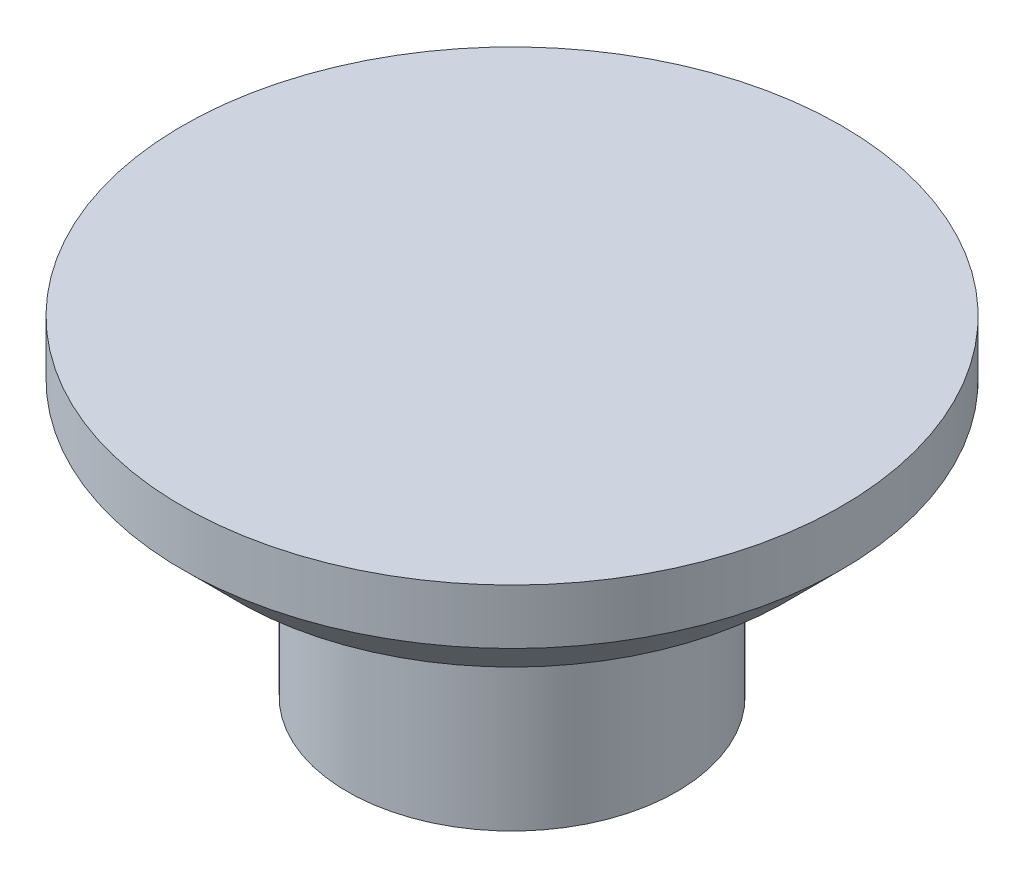
ISO-10303-21;
HEADER;
FILE_DESCRIPTION(('STEP AP214'),'2;1');
FILE_NAME('part.step','',(''),(''),'','','');
FILE_SCHEMA(('AUTOMOTIVE_DESIGN { 1 0 10303 214 1 1 1 1 }'));
ENDSEC;
DATA;
#1=APPLICATION_CONTEXT('core data for automotive mechanical design processes');
#2=APPLICATION_PROTOCOL_DEFINITION('international standard','automotive_design',2000,#1);
#3=PRODUCT_CONTEXT('',#1,'mechanical');
#4=PRODUCT('Part','Part','',(#3));
#5=PRODUCT_RELATED_PRODUCT_CATEGORY('part','',(#4));
#6=PRODUCT_DEFINITION_FORMATION('','',#4);
#7=PRODUCT_DEFINITION_CONTEXT('part definition',#1,'design');
#8=PRODUCT_DEFINITION('design','',#6,#7);
#9=PRODUCT_DEFINITION_SHAPE('','',#8);
#10=(LENGTH_UNIT() NAMED_UNIT(*) SI_UNIT(.MILLI.,.METRE.));
#11=(NAMED_UNIT(*) PLANE_ANGLE_UNIT() SI_UNIT($,.RADIAN.));
#12=(NAMED_UNIT(*) SI_UNIT($,.STERADIAN.) SOLID_ANGLE_UNIT());
#13=UNCERTAINTY_MEASURE_WITH_UNIT(LENGTH_MEASURE(1.E-05),#10,'distance_accuracy_value','');
#14=(GEOMETRIC_REPRESENTATION_CONTEXT(3) GLOBAL_UNCERTAINTY_ASSIGNED_CONTEXT((#13)) GLOBAL_UNIT_ASSIGNED_CONTEXT((#10,
#11,#12)) REPRESENTATION_CONTEXT('',''));
#15=CARTESIAN_POINT('',(0.,0.,0.));
#16=DIRECTION('',(0.,0.,1.));
#17=DIRECTION('',(1.,0.,0.));
#18=AXIS2_PLACEMENT_3D('',#15,#16,#17);
#19=CARTESIAN_POINT('',(0.,-6.,0.));
#20=DIRECTION('',(0.,-1.,0.));
#21=DIRECTION('',(1.,0.,0.));
#22=AXIS2_PLACEMENT_3D('',#19,#20,#21);
#23=SPHERICAL_SURFACE('',#22,1.5);
#24=CARTESIAN_POINT('',(0.,-6.,0.));
#25=DIRECTION('',(0.,-1.,0.));
#26=DIRECTION('',(0.,0.,-1.));
#27=AXIS2_PLACEMENT_3D('',#24,#25,#26);
#28=CIRCLE('',#27,1.5);
#29=CARTESIAN_POINT('',(0.,-6.,-1.5));
#30=VERTEX_POINT('',#29);
#31=EDGE_CURVE('E10',#30,#30,#28,.T.);
#32=ORIENTED_EDGE('',*,*,#31,.T.);
#33=EDGE_LOOP('',(#32));
#34=FACE_BOUND('',#33,.T.);
#35=ADVANCED_FACE('F28',(#34),#23,.F.);
#36=CARTESIAN_POINT('',(3.,-6.,0.));
#37=DIRECTION('',(0.,-1.,0.));
#38=DIRECTION('',(0.,0.,-1.));
#39=AXIS2_PLACEMENT_3D('',#36,#37,#38);
#40=PLANE('',#39);
#41=CARTESIAN_POINT('',(0.,-6.,0.));
#42=DIRECTION('',(0.,-1.,0.));
#43=DIRECTION('',(0.,0.,-1.));
#44=AXIS2_PLACEMENT_3D('',#41,#42,#43);
#45=CIRCLE('',#44,3.);
#46=CARTESIAN_POINT('',(0.,-6.,-3.));
#47=VERTEX_POINT('',#46);
#48=EDGE_CURVE('E34',#47,#47,#45,.T.);
#49=ORIENTED_EDGE('',*,*,#48,.T.);
#50=EDGE_LOOP('',(#49));
#51=FACE_BOUND('',#50,.T.);
#52=ORIENTED_EDGE('',*,*,#31,.F.);
#53=EDGE_LOOP('',(#52));
#54=FACE_BOUND('',#53,.T.);
#55=ADVANCED_FACE('F69',(#51,#54),#40,.T.);
#56=CARTESIAN_POINT('',(0.,-4.5,0.));
#57=DIRECTION('',(0.,-1.,0.));
#58=DIRECTION('',(0.,0.,-1.));
#59=AXIS2_PLACEMENT_3D('',#56,#57,#58);
#60=CYLINDRICAL_SURFACE('',#59,3.);
#61=CARTESIAN_POINT('',(0.,-3.00000000000001,0.));
#62=DIRECTION('',(0.,-1.,0.));
#63=DIRECTION('',(0.,0.,-1.));
#64=AXIS2_PLACEMENT_3D('',#61,#62,#63);
#65=CIRCLE('',#64,3.);
#66=CARTESIAN_POINT('',(0.,-3.00000000000001,-3.));
#67=VERTEX_POINT('',#66);
#68=EDGE_CURVE('E38',#67,#67,#65,.T.);
#69=ORIENTED_EDGE('',*,*,#68,.T.);
#70=EDGE_LOOP('',(#69));
#71=FACE_BOUND('',#70,.T.);
#72=ORIENTED_EDGE('',*,*,#48,.F.);
#73=EDGE_LOOP('',(#72));
#74=FACE_BOUND('',#73,.T.);
#75=ADVANCED_FACE('F73',(#71,#74),#60,.T.);
#76=CARTESIAN_POINT('',(0.,-3.,0.));
#77=DIRECTION('',(0.,-1.,0.));
#78=DIRECTION('',(0.,0.,-1.));
#79=AXIS2_PLACEMENT_3D('',#76,#77,#78);
#80=TOROIDAL_SURFACE('',#79,4.,1.);
#81=CARTESIAN_POINT('',(0.,-2.,0.));
#82=DIRECTION('',(0.,-1.,0.));
#83=DIRECTION('',(0.,0.,-1.));
#84=AXIS2_PLACEMENT_3D('',#81,#82,#83);
#85=CIRCLE('',#84,4.00000000000001);
#86=CARTESIAN_POINT('',(0.,-2.,-4.00000000000001));
#87=VERTEX_POINT('',#86);
#88=EDGE_CURVE('E42',#87,#87,#85,.T.);
#89=ORIENTED_EDGE('',*,*,#88,.T.);
#90=EDGE_LOOP('',(#89));
#91=FACE_BOUND('',#90,.T.);
#92=ORIENTED_EDGE('',*,*,#68,.F.);
#93=EDGE_LOOP('',(#92));
#94=FACE_BOUND('',#93,.T.);
#95=ADVANCED_FACE('F77',(#91,#94),#80,.F.);
#96=CARTESIAN_POINT('',(5.,-2.,0.));
#97=DIRECTION('',(0.,-1.,0.));
#98=DIRECTION('',(0.,0.,-1.));
#99=AXIS2_PLACEMENT_3D('',#96,#97,#98);
#100=PLANE('',#99);
#101=CARTESIAN_POINT('',(0.,-2.,0.));
#102=DIRECTION('',(0.,-1.,0.));
#103=DIRECTION('',(0.,0.,-1.));
#104=AXIS2_PLACEMENT_3D('',#101,#102,#103);
#105=CIRCLE('',#104,5.);
#106=CARTESIAN_POINT('',(0.,-2.,-5.));
#107=VERTEX_POINT('',#106);
#108=EDGE_CURVE('E47',#107,#107,#105,.T.);
#109=ORIENTED_EDGE('',*,*,#108,.T.);
#110=EDGE_LOOP('',(#109));
#111=FACE_BOUND('',#110,.T.);
#112=ORIENTED_EDGE('',*,*,#88,.F.);
#113=EDGE_LOOP('',(#112));
#114=FACE_BOUND('',#113,.T.);
#115=ADVANCED_FACE('F84',(#111,#114),#100,.T.);
#116=CARTESIAN_POINT('',(0.,-2.,0.));
#117=DIRECTION('',(0.,1.,0.));
#118=DIRECTION('',(0.,0.,1.));
#119=AXIS2_PLACEMENT_3D('',#116,#117,#118);
#120=CONICAL_SURFACE('',#119,5.,0.785398163397448);
#121=CARTESIAN_POINT('',(0.,-1.,0.));
#122=DIRECTION('',(0.,-1.,0.));
#123=DIRECTION('',(0.,0.,-1.));
#124=AXIS2_PLACEMENT_3D('',#121,#122,#123);
#125=CIRCLE('',#124,6.);
#126=CARTESIAN_POINT('',(0.,-1.,-6.));
#127=VERTEX_POINT('',#126);
#128=EDGE_CURVE('E50',#127,#127,#125,.T.);
#129=ORIENTED_EDGE('',*,*,#128,.T.);
#130=EDGE_LOOP('',(#129));
#131=FACE_BOUND('',#130,.T.);
#132=ORIENTED_EDGE('',*,*,#108,.F.);
#133=EDGE_LOOP('',(#132));
#134=FACE_BOUND('',#133,.T.);
#135=ADVANCED_FACE('F66',(#131,#134),#120,.T.);
#136=CARTESIAN_POINT('',(0.,-4.5,0.));
#137=DIRECTION('',(0.,-1.,0.));
#138=DIRECTION('',(0.,0.,-1.));
#139=AXIS2_PLACEMENT_3D('',#136,#137,#138);
#140=CYLINDRICAL_SURFACE('',#139,6.);
#141=CARTESIAN_POINT('',(0.,0.,0.));
#142=DIRECTION('',(0.,-1.,0.));
#143=DIRECTION('',(0.,0.,-1.));
#144=AXIS2_PLACEMENT_3D('',#141,#142,#143);
#145=CIRCLE('',#144,6.);
#146=CARTESIAN_POINT('',(0.,0.,-6.));
#147=VERTEX_POINT('',#146);
#148=EDGE_CURVE('E53',#147,#147,#145,.T.);
#149=ORIENTED_EDGE('',*,*,#148,.T.);
#150=EDGE_LOOP('',(#149));
#151=FACE_BOUND('',#150,.T.);
#152=ORIENTED_EDGE('',*,*,#128,.F.);
#153=EDGE_LOOP('',(#152));
#154=FACE_BOUND('',#153,.T.);
#155=ADVANCED_FACE('F57',(#151,#154),#140,.T.);
#156=CARTESIAN_POINT('',(0.,0.,0.));
#157=DIRECTION('',(0.,1.,0.));
#158=DIRECTION('',(0.,0.,1.));
#159=AXIS2_PLACEMENT_3D('',#156,#157,#158);
#160=PLANE('',#159);
#161=ORIENTED_EDGE('',*,*,#148,.F.);
#162=EDGE_LOOP('',(#161));
#163=FACE_BOUND('',#162,.T.);
#164=ADVANCED_FACE('F60',(#163),#160,.T.);
#165=CLOSED_SHELL('',(#35,#55,#75,#95,#115,#135,#155,#164));
#166=MANIFOLD_SOLID_BREP('B2',#165);
#167=ADVANCED_BREP_SHAPE_REPRESENTATION('',(#18,#166),#14);
#168=SHAPE_DEFINITION_REPRESENTATION(#9,#167);
ENDSEC;
END-ISO-10303-21;
